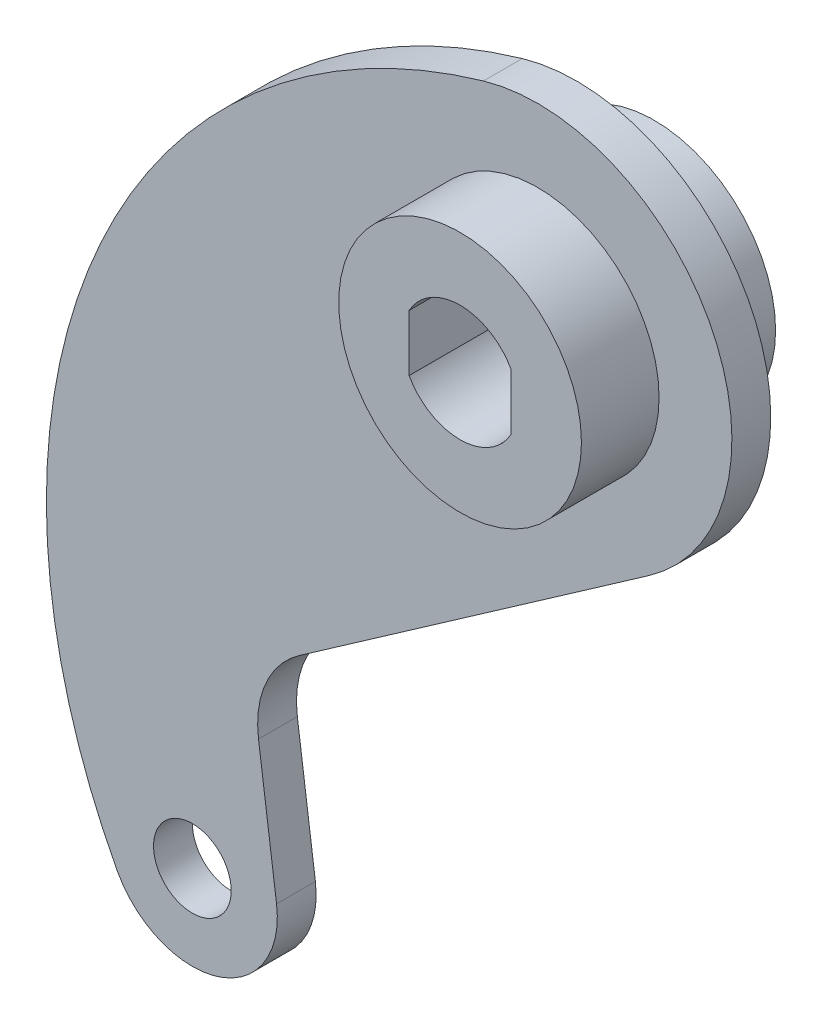
ISO-10303-21;
HEADER;
FILE_DESCRIPTION(('STEP AP214'),'2;1');
FILE_NAME('part.step','',(''),(''),'','','');
FILE_SCHEMA(('AUTOMOTIVE_DESIGN { 1 0 10303 214 1 1 1 1 }'));
ENDSEC;
DATA;
#1=APPLICATION_CONTEXT('core data for automotive mechanical design processes');
#2=APPLICATION_PROTOCOL_DEFINITION('international standard','automotive_design',2000,#1);
#3=PRODUCT_CONTEXT('',#1,'mechanical');
#4=PRODUCT('Part','Part','',(#3));
#5=PRODUCT_RELATED_PRODUCT_CATEGORY('part','',(#4));
#6=PRODUCT_DEFINITION_FORMATION('','',#4);
#7=PRODUCT_DEFINITION_CONTEXT('part definition',#1,'design');
#8=PRODUCT_DEFINITION('design','',#6,#7);
#9=PRODUCT_DEFINITION_SHAPE('','',#8);
#10=(LENGTH_UNIT() NAMED_UNIT(*) SI_UNIT(.MILLI.,.METRE.));
#11=(NAMED_UNIT(*) PLANE_ANGLE_UNIT() SI_UNIT($,.RADIAN.));
#12=(NAMED_UNIT(*) SI_UNIT($,.STERADIAN.) SOLID_ANGLE_UNIT());
#13=UNCERTAINTY_MEASURE_WITH_UNIT(LENGTH_MEASURE(1.E-05),#10,'distance_accuracy_value','');
#14=(GEOMETRIC_REPRESENTATION_CONTEXT(3) GLOBAL_UNCERTAINTY_ASSIGNED_CONTEXT((#13)) GLOBAL_UNIT_ASSIGNED_CONTEXT((#10,
#11,#12)) REPRESENTATION_CONTEXT('',''));
#15=CARTESIAN_POINT('',(0.,0.,0.));
#16=DIRECTION('',(0.,0.,1.));
#17=DIRECTION('',(1.,0.,0.));
#18=AXIS2_PLACEMENT_3D('',#15,#16,#17);
#19=CARTESIAN_POINT('',(0.,0.,16.));
#20=DIRECTION('',(0.,0.,1.));
#21=DIRECTION('',(1.,0.,0.));
#22=AXIS2_PLACEMENT_3D('',#19,#20,#21);
#23=CYLINDRICAL_SURFACE('',#22,40.);
#24=CARTESIAN_POINT('',(0.,0.,24.));
#25=DIRECTION('',(0.,0.,1.));
#26=DIRECTION('',(1.,0.,0.));
#27=AXIS2_PLACEMENT_3D('',#24,#25,#26);
#28=CIRCLE('',#27,40.);
#29=CARTESIAN_POINT('',(22.8949024711143,-32.7997475727812,24.));
#30=VERTEX_POINT('',#29);
#31=CARTESIAN_POINT('',(-11.190557993134,38.4027526591819,24.));
#32=VERTEX_POINT('',#31);
#33=EDGE_CURVE('E145',#30,#32,#28,.T.);
#34=ORIENTED_EDGE('',*,*,#33,.F.);
#35=DIRECTION('',(0.,0.,1.));
#36=VECTOR('',#35,1.);
#37=CARTESIAN_POINT('',(22.8949024711143,-32.7997475727812,16.));
#38=LINE('',#37,#36);
#39=CARTESIAN_POINT('',(22.8949024711143,-32.7997475727812,16.));
#40=VERTEX_POINT('',#39);
#41=EDGE_CURVE('E126',#40,#30,#38,.T.);
#42=ORIENTED_EDGE('',*,*,#41,.F.);
#43=CARTESIAN_POINT('',(0.,0.,16.));
#44=DIRECTION('',(0.,0.,1.));
#45=DIRECTION('',(1.,0.,0.));
#46=AXIS2_PLACEMENT_3D('',#43,#44,#45);
#47=CIRCLE('',#46,40.);
#48=CARTESIAN_POINT('',(-11.190557993134,38.4027526591819,16.));
#49=VERTEX_POINT('',#48);
#50=EDGE_CURVE('E119',#40,#49,#47,.T.);
#51=ORIENTED_EDGE('',*,*,#50,.T.);
#52=DIRECTION('',(0.,0.,1.));
#53=VECTOR('',#52,1.);
#54=CARTESIAN_POINT('',(-11.190557993134,38.4027526591819,16.));
#55=LINE('',#54,#53);
#56=EDGE_CURVE('E102',#49,#32,#55,.T.);
#57=ORIENTED_EDGE('',*,*,#56,.T.);
#58=EDGE_LOOP('',(#34,#42,#51,#57));
#59=FACE_BOUND('',#58,.T.);
#60=ADVANCED_FACE('F51',(#59),#23,.T.);
#61=CARTESIAN_POINT('',(22.8949024711143,-32.7997475727812,16.));
#62=DIRECTION('',(0.572372561777858,-0.819993689319529,0.));
#63=DIRECTION('',(0.819993689319529,0.572372561777858,0.));
#64=AXIS2_PLACEMENT_3D('',#61,#62,#63);
#65=PLANE('',#64);
#66=DIRECTION('',(0.819993689319529,0.572372561777858,0.));
#67=VECTOR('',#66,1.);
#68=CARTESIAN_POINT('',(22.8949024711143,-32.7997475727812,24.));
#69=LINE('',#68,#67);
#70=CARTESIAN_POINT('',(-49.1499316086711,-83.0885324527326,24.));
#71=VERTEX_POINT('',#70);
#72=EDGE_CURVE('E153',#71,#30,#69,.T.);
#73=ORIENTED_EDGE('',*,*,#72,.F.);
#74=DIRECTION('',(0.,0.,1.));
#75=VECTOR('',#74,1.);
#76=CARTESIAN_POINT('',(-49.1499316086711,-83.0885324527326,16.));
#77=LINE('',#76,#75);
#78=CARTESIAN_POINT('',(-49.1499316086711,-83.0885324527326,16.));
#79=VERTEX_POINT('',#78);
#80=EDGE_CURVE('E66',#71,#79,#77,.F.);
#81=ORIENTED_EDGE('',*,*,#80,.T.);
#82=DIRECTION('',(0.819993689319529,0.572372561777858,0.));
#83=VECTOR('',#82,1.);
#84=CARTESIAN_POINT('',(22.8949024711143,-32.7997475727812,16.));
#85=LINE('',#84,#83);
#86=EDGE_CURVE('E113',#79,#40,#85,.T.);
#87=ORIENTED_EDGE('',*,*,#86,.T.);
#88=ORIENTED_EDGE('',*,*,#41,.T.);
#89=EDGE_LOOP('',(#73,#81,#87,#88));
#90=FACE_BOUND('',#89,.T.);
#91=ADVANCED_FACE('F179',(#90),#65,.T.);
#92=CARTESIAN_POINT('',(-70.0330991321324,-9.44993463973792,16.));
#93=DIRECTION('',(0.991018698460731,0.133723368568095,0.));
#94=DIRECTION('',(-0.133723368568095,0.991018698460731,0.));
#95=AXIS2_PLACEMENT_3D('',#92,#93,#94);
#96=PLANE('',#95);
#97=DIRECTION('',(-0.133723368568095,0.991018698460731,0.));
#98=VECTOR('',#97,1.);
#99=CARTESIAN_POINT('',(-70.0330991321324,-9.44993463973792,16.));
#100=LINE('',#99,#98);
#101=CARTESIAN_POINT('',(-53.8054274746344,-129.712579959449,16.));
#102=VERTEX_POINT('',#101);
#103=CARTESIAN_POINT('',(-57.5228543423286,-102.162873610485,16.));
#104=VERTEX_POINT('',#103);
#105=EDGE_CURVE('E135',#102,#104,#100,.T.);
#106=ORIENTED_EDGE('',*,*,#105,.T.);
#107=DIRECTION('',(0.,0.,1.));
#108=VECTOR('',#107,1.);
#109=CARTESIAN_POINT('',(-57.5228543423286,-102.162873610485,24.));
#110=LINE('',#109,#108);
#111=CARTESIAN_POINT('',(-57.5228543423286,-102.162873610485,24.));
#112=VERTEX_POINT('',#111);
#113=EDGE_CURVE('E156',#104,#112,#110,.T.);
#114=ORIENTED_EDGE('',*,*,#113,.T.);
#115=DIRECTION('',(-0.133723368568095,0.991018698460731,0.));
#116=VECTOR('',#115,1.);
#117=CARTESIAN_POINT('',(-70.0330991321324,-9.44993463973792,24.));
#118=LINE('',#117,#116);
#119=CARTESIAN_POINT('',(-53.8054274746344,-129.712579959449,24.));
#120=VERTEX_POINT('',#119);
#121=EDGE_CURVE('E151',#120,#112,#118,.T.);
#122=ORIENTED_EDGE('',*,*,#121,.F.);
#123=DIRECTION('',(0.,0.,1.));
#124=VECTOR('',#123,1.);
#125=CARTESIAN_POINT('',(-53.8054274746344,-129.712579959449,16.));
#126=LINE('',#125,#124);
#127=EDGE_CURVE('E157',#102,#120,#126,.T.);
#128=ORIENTED_EDGE('',*,*,#127,.F.);
#129=EDGE_LOOP('',(#106,#114,#122,#128));
#130=FACE_BOUND('',#129,.T.);
#131=ADVANCED_FACE('F165',(#130),#96,.T.);
#132=CARTESIAN_POINT('',(-71.1482546976971,-132.05273890939,16.));
#133=DIRECTION('',(0.,0.,1.));
#134=DIRECTION('',(1.,0.,0.));
#135=AXIS2_PLACEMENT_3D('',#132,#133,#134);
#136=CYLINDRICAL_SURFACE('',#135,17.4999999999999);
#137=CARTESIAN_POINT('',(-71.1482546976971,-132.05273890939,24.));
#138=DIRECTION('',(0.,0.,1.));
#139=DIRECTION('',(1.,0.,0.));
#140=AXIS2_PLACEMENT_3D('',#137,#138,#139);
#141=CIRCLE('',#140,17.4999999999999);
#142=CARTESIAN_POINT('',(-86.6016810472726,-140.265023248004,24.));
#143=VERTEX_POINT('',#142);
#144=EDGE_CURVE('E148',#143,#120,#141,.T.);
#145=ORIENTED_EDGE('',*,*,#144,.F.);
#146=DIRECTION('',(0.,0.,1.));
#147=VECTOR('',#146,1.);
#148=CARTESIAN_POINT('',(-86.6016810472726,-140.265023248004,16.));
#149=LINE('',#148,#147);
#150=CARTESIAN_POINT('',(-86.6016810472726,-140.265023248004,16.));
#151=VERTEX_POINT('',#150);
#152=EDGE_CURVE('E112',#151,#143,#149,.T.);
#153=ORIENTED_EDGE('',*,*,#152,.F.);
#154=CARTESIAN_POINT('',(-71.1482546976971,-132.05273890939,16.));
#155=DIRECTION('',(0.,0.,1.));
#156=DIRECTION('',(1.,0.,0.));
#157=AXIS2_PLACEMENT_3D('',#154,#155,#156);
#158=CIRCLE('',#157,17.4999999999999);
#159=EDGE_CURVE('E122',#151,#102,#158,.T.);
#160=ORIENTED_EDGE('',*,*,#159,.T.);
#161=ORIENTED_EDGE('',*,*,#127,.T.);
#162=EDGE_LOOP('',(#145,#153,#160,#161));
#163=FACE_BOUND('',#162,.T.);
#164=ADVANCED_FACE('F171',(#163),#136,.T.);
#165=CARTESIAN_POINT('',(-71.1482546976971,-132.05273890939,16.));
#166=DIRECTION('',(0.,0.,1.));
#167=DIRECTION('',(1.,0.,0.));
#168=AXIS2_PLACEMENT_3D('',#165,#166,#167);
#169=CYLINDRICAL_SURFACE('',#168,8.00000000000003);
#170=CARTESIAN_POINT('',(-71.1482546976971,-132.05273890939,16.));
#171=DIRECTION('',(0.,0.,1.));
#172=DIRECTION('',(1.,0.,0.));
#173=AXIS2_PLACEMENT_3D('',#170,#171,#172);
#174=CIRCLE('',#173,8.00000000000003);
#175=CARTESIAN_POINT('',(-63.1482546976971,-132.05273890939,16.));
#176=VERTEX_POINT('',#175);
#177=EDGE_CURVE('E127',#176,#176,#174,.T.);
#178=ORIENTED_EDGE('',*,*,#177,.F.);
#179=EDGE_LOOP('',(#178));
#180=FACE_BOUND('',#179,.T.);
#181=CARTESIAN_POINT('',(-71.1482546976971,-132.05273890939,24.));
#182=DIRECTION('',(0.,0.,1.));
#183=DIRECTION('',(1.,0.,0.));
#184=AXIS2_PLACEMENT_3D('',#181,#182,#183);
#185=CIRCLE('',#184,8.00000000000003);
#186=CARTESIAN_POINT('',(-63.1482546976971,-132.05273890939,24.));
#187=VERTEX_POINT('',#186);
#188=EDGE_CURVE('E142',#187,#187,#185,.T.);
#189=ORIENTED_EDGE('',*,*,#188,.T.);
#190=EDGE_LOOP('',(#189));
#191=FACE_BOUND('',#190,.T.);
#192=ADVANCED_FACE('F188',(#180,#191),#169,.F.);
#193=CARTESIAN_POINT('',(0.,0.,16.));
#194=DIRECTION('',(0.,0.,1.));
#195=DIRECTION('',(1.,0.,0.));
#196=AXIS2_PLACEMENT_3D('',#193,#194,#195);
#197=CYLINDRICAL_SURFACE('',#196,25.);
#198=CARTESIAN_POINT('',(0.,0.,16.));
#199=DIRECTION('',(0.,0.,1.));
#200=DIRECTION('',(1.,0.,0.));
#201=AXIS2_PLACEMENT_3D('',#198,#199,#200);
#202=CIRCLE('',#201,25.);
#203=CARTESIAN_POINT('',(25.,0.,16.));
#204=VERTEX_POINT('',#203);
#205=EDGE_CURVE('E130',#204,#204,#202,.T.);
#206=ORIENTED_EDGE('',*,*,#205,.F.);
#207=EDGE_LOOP('',(#206));
#208=FACE_BOUND('',#207,.T.);
#209=CARTESIAN_POINT('',(0.,0.,24.));
#210=DIRECTION('',(0.,0.,1.));
#211=DIRECTION('',(1.,0.,0.));
#212=AXIS2_PLACEMENT_3D('',#209,#210,#211);
#213=CIRCLE('',#212,25.);
#214=CARTESIAN_POINT('',(25.,0.,24.));
#215=VERTEX_POINT('',#214);
#216=EDGE_CURVE('E139',#215,#215,#213,.T.);
#217=ORIENTED_EDGE('',*,*,#216,.T.);
#218=EDGE_LOOP('',(#217));
#219=FACE_BOUND('',#218,.T.);
#220=ADVANCED_FACE('F190',(#208,#219),#197,.F.);
#221=CARTESIAN_POINT('',(23.7799357354098,-81.6058494007616,16.));
#222=DIRECTION('',(0.,0.,1.));
#223=DIRECTION('',(1.,0.,0.));
#224=AXIS2_PLACEMENT_3D('',#221,#222,#223);
#225=CYLINDRICAL_SURFACE('',#224,125.);
#226=CARTESIAN_POINT('',(23.7799357354098,-81.6058494007616,24.));
#227=DIRECTION('',(0.,0.,1.));
#228=DIRECTION('',(1.,0.,0.));
#229=AXIS2_PLACEMENT_3D('',#226,#227,#228);
#230=CIRCLE('',#229,125.);
#231=EDGE_CURVE('E107',#32,#143,#230,.T.);
#232=ORIENTED_EDGE('',*,*,#231,.F.);
#233=ORIENTED_EDGE('',*,*,#56,.F.);
#234=CARTESIAN_POINT('',(23.7799357354098,-81.6058494007616,16.));
#235=DIRECTION('',(0.,0.,1.));
#236=DIRECTION('',(1.,0.,0.));
#237=AXIS2_PLACEMENT_3D('',#234,#235,#236);
#238=CIRCLE('',#237,125.);
#239=EDGE_CURVE('E105',#49,#151,#238,.T.);
#240=ORIENTED_EDGE('',*,*,#239,.T.);
#241=ORIENTED_EDGE('',*,*,#152,.T.);
#242=EDGE_LOOP('',(#232,#233,#240,#241));
#243=FACE_BOUND('',#242,.T.);
#244=ADVANCED_FACE('F104',(#243),#225,.T.);
#245=CARTESIAN_POINT('',(0.,0.,16.));
#246=DIRECTION('',(0.,0.,1.));
#247=DIRECTION('',(1.,0.,0.));
#248=AXIS2_PLACEMENT_3D('',#245,#246,#247);
#249=PLANE('',#248);
#250=ORIENTED_EDGE('',*,*,#205,.T.);
#251=EDGE_LOOP('',(#250));
#252=FACE_BOUND('',#251,.T.);
#253=ORIENTED_EDGE('',*,*,#177,.T.);
#254=EDGE_LOOP('',(#253));
#255=FACE_BOUND('',#254,.T.);
#256=ORIENTED_EDGE('',*,*,#50,.F.);
#257=ORIENTED_EDGE('',*,*,#86,.F.);
#258=CARTESIAN_POINT('',(-37.702480373114,-99.4884062391232,16.));
#259=DIRECTION('',(0.,0.,1.));
#260=DIRECTION('',(1.,0.,0.));
#261=AXIS2_PLACEMENT_3D('',#258,#259,#260);
#262=CIRCLE('',#261,20.);
#263=EDGE_CURVE('E12',#79,#104,#262,.T.);
#264=ORIENTED_EDGE('',*,*,#263,.T.);
#265=ORIENTED_EDGE('',*,*,#105,.F.);
#266=ORIENTED_EDGE('',*,*,#159,.F.);
#267=ORIENTED_EDGE('',*,*,#239,.F.);
#268=EDGE_LOOP('',(#256,#257,#264,#265,#266,#267));
#269=FACE_BOUND('',#268,.T.);
#270=ADVANCED_FACE('F118',(#252,#255,#269),#249,.F.);
#271=CARTESIAN_POINT('',(0.,0.,24.));
#272=DIRECTION('',(0.,0.,1.));
#273=DIRECTION('',(1.,0.,0.));
#274=AXIS2_PLACEMENT_3D('',#271,#272,#273);
#275=PLANE('',#274);
#276=ORIENTED_EDGE('',*,*,#216,.F.);
#277=EDGE_LOOP('',(#276));
#278=FACE_BOUND('',#277,.T.);
#279=ORIENTED_EDGE('',*,*,#188,.F.);
#280=EDGE_LOOP('',(#279));
#281=FACE_BOUND('',#280,.T.);
#282=ORIENTED_EDGE('',*,*,#33,.T.);
#283=ORIENTED_EDGE('',*,*,#231,.T.);
#284=ORIENTED_EDGE('',*,*,#144,.T.);
#285=ORIENTED_EDGE('',*,*,#121,.T.);
#286=CARTESIAN_POINT('',(-37.702480373114,-99.4884062391232,24.));
#287=DIRECTION('',(0.,0.,1.));
#288=DIRECTION('',(1.,0.,0.));
#289=AXIS2_PLACEMENT_3D('',#286,#287,#288);
#290=CIRCLE('',#289,20.);
#291=EDGE_CURVE('E59',#112,#71,#290,.F.);
#292=ORIENTED_EDGE('',*,*,#291,.T.);
#293=ORIENTED_EDGE('',*,*,#72,.T.);
#294=EDGE_LOOP('',(#282,#283,#284,#285,#292,#293));
#295=FACE_BOUND('',#294,.T.);
#296=ADVANCED_FACE('F168',(#278,#281,#295),#275,.T.);
#297=CARTESIAN_POINT('',(-37.702480373114,-99.4884062391232,16.));
#298=DIRECTION('',(0.,0.,-1.));
#299=DIRECTION('',(-1.,0.,0.));
#300=AXIS2_PLACEMENT_3D('',#297,#298,#299);
#301=CYLINDRICAL_SURFACE('',#300,20.);
#302=ORIENTED_EDGE('',*,*,#263,.F.);
#303=ORIENTED_EDGE('',*,*,#80,.F.);
#304=ORIENTED_EDGE('',*,*,#291,.F.);
#305=ORIENTED_EDGE('',*,*,#113,.F.);
#306=EDGE_LOOP('',(#302,#303,#304,#305));
#307=FACE_BOUND('',#306,.T.);
#308=ADVANCED_FACE('F53',(#307),#301,.F.);
#309=CLOSED_SHELL('',(#60,#91,#131,#164,#192,#220,#244,#270,#296,#308));
#310=MANIFOLD_SOLID_BREP('B2',#309);
#311=CARTESIAN_POINT('',(0.,0.,40.));
#312=DIRECTION('',(0.,0.,-1.));
#313=DIRECTION('',(-1.,0.,0.));
#314=AXIS2_PLACEMENT_3D('',#311,#312,#313);
#315=CYLINDRICAL_SURFACE('',#314,12.);
#316=DIRECTION('',(0.,0.,1.));
#317=VECTOR('',#316,1.);
#318=CARTESIAN_POINT('',(10.5,5.80947501931112,-11.71537451386));
#319=LINE('',#318,#317);
#320=CARTESIAN_POINT('',(10.5,5.80947501931112,0.));
#321=VERTEX_POINT('',#320);
#322=CARTESIAN_POINT('',(10.5,5.80947501931112,40.));
#323=VERTEX_POINT('',#322);
#324=EDGE_CURVE('E290',#321,#323,#319,.T.);
#325=ORIENTED_EDGE('',*,*,#324,.T.);
#326=CARTESIAN_POINT('',(0.,0.,40.));
#327=DIRECTION('',(0.,0.,1.));
#328=DIRECTION('',(1.,0.,0.));
#329=AXIS2_PLACEMENT_3D('',#326,#327,#328);
#330=CIRCLE('',#329,12.);
#331=CARTESIAN_POINT('',(-10.5,5.80947501931112,40.));
#332=VERTEX_POINT('',#331);
#333=EDGE_CURVE('E327',#323,#332,#330,.T.);
#334=ORIENTED_EDGE('',*,*,#333,.T.);
#335=DIRECTION('',(0.,0.,1.));
#336=VECTOR('',#335,1.);
#337=CARTESIAN_POINT('',(-10.5,5.80947501931112,-11.71537451386));
#338=LINE('',#337,#336);
#339=CARTESIAN_POINT('',(-10.5,5.80947501931112,0.));
#340=VERTEX_POINT('',#339);
#341=EDGE_CURVE('E342',#340,#332,#338,.T.);
#342=ORIENTED_EDGE('',*,*,#341,.F.);
#343=CARTESIAN_POINT('',(0.,0.,0.));
#344=DIRECTION('',(0.,0.,1.));
#345=DIRECTION('',(1.,0.,0.));
#346=AXIS2_PLACEMENT_3D('',#343,#344,#345);
#347=CIRCLE('',#346,12.);
#348=EDGE_CURVE('E329',#321,#340,#347,.T.);
#349=ORIENTED_EDGE('',*,*,#348,.F.);
#350=EDGE_LOOP('',(#325,#334,#342,#349));
#351=FACE_BOUND('',#350,.T.);
#352=ADVANCED_FACE('F275',(#351),#315,.F.);
#353=CARTESIAN_POINT('',(0.,0.,40.));
#354=DIRECTION('',(0.,0.,1.));
#355=DIRECTION('',(1.,0.,0.));
#356=AXIS2_PLACEMENT_3D('',#353,#354,#355);
#357=PLANE('',#356);
#358=CARTESIAN_POINT('',(0.,0.,40.));
#359=DIRECTION('',(0.,0.,1.));
#360=DIRECTION('',(1.,0.,0.));
#361=AXIS2_PLACEMENT_3D('',#358,#359,#360);
#362=CIRCLE('',#361,25.);
#363=CARTESIAN_POINT('',(25.,0.,40.));
#364=VERTEX_POINT('',#363);
#365=EDGE_CURVE('E49',#364,#364,#362,.T.);
#366=ORIENTED_EDGE('',*,*,#365,.T.);
#367=EDGE_LOOP('',(#366));
#368=FACE_BOUND('',#367,.T.);
#369=CARTESIAN_POINT('',(-10.5,-5.80947501931112,40.));
#370=VERTEX_POINT('',#369);
#371=CARTESIAN_POINT('',(10.5,-5.80947501931112,40.));
#372=VERTEX_POINT('',#371);
#373=EDGE_CURVE('E334',#370,#372,#330,.T.);
#374=ORIENTED_EDGE('',*,*,#373,.F.);
#375=DIRECTION('',(0.,1.,0.));
#376=VECTOR('',#375,1.);
#377=CARTESIAN_POINT('',(-10.5,-5.80947501931112,40.));
#378=LINE('',#377,#376);
#379=EDGE_CURVE('E333',#370,#332,#378,.T.);
#380=ORIENTED_EDGE('',*,*,#379,.T.);
#381=ORIENTED_EDGE('',*,*,#333,.F.);
#382=DIRECTION('',(0.,-1.,0.));
#383=VECTOR('',#382,1.);
#384=CARTESIAN_POINT('',(10.5,-5.80947501931112,40.));
#385=LINE('',#384,#383);
#386=EDGE_CURVE('E315',#323,#372,#385,.T.);
#387=ORIENTED_EDGE('',*,*,#386,.T.);
#388=EDGE_LOOP('',(#374,#380,#381,#387));
#389=FACE_BOUND('',#388,.T.);
#390=ADVANCED_FACE('F332',(#368,#389),#357,.T.);
#391=CARTESIAN_POINT('',(0.,0.,0.));
#392=DIRECTION('',(0.,0.,1.));
#393=DIRECTION('',(1.,0.,0.));
#394=AXIS2_PLACEMENT_3D('',#391,#392,#393);
#395=PLANE('',#394);
#396=CARTESIAN_POINT('',(0.,0.,0.));
#397=DIRECTION('',(0.,0.,1.));
#398=DIRECTION('',(1.,0.,0.));
#399=AXIS2_PLACEMENT_3D('',#396,#397,#398);
#400=CIRCLE('',#399,25.);
#401=CARTESIAN_POINT('',(25.,0.,0.));
#402=VERTEX_POINT('',#401);
#403=EDGE_CURVE('E279',#402,#402,#400,.T.);
#404=ORIENTED_EDGE('',*,*,#403,.F.);
#405=EDGE_LOOP('',(#404));
#406=FACE_BOUND('',#405,.T.);
#407=CARTESIAN_POINT('',(-10.5,-5.80947501931112,0.));
#408=VERTEX_POINT('',#407);
#409=CARTESIAN_POINT('',(10.5,-5.80947501931112,0.));
#410=VERTEX_POINT('',#409);
#411=EDGE_CURVE('E335',#408,#410,#347,.T.);
#412=ORIENTED_EDGE('',*,*,#411,.T.);
#413=DIRECTION('',(0.,1.,0.));
#414=VECTOR('',#413,1.);
#415=CARTESIAN_POINT('',(10.5,-5.80947501931112,0.));
#416=LINE('',#415,#414);
#417=EDGE_CURVE('E346',#410,#321,#416,.T.);
#418=ORIENTED_EDGE('',*,*,#417,.T.);
#419=ORIENTED_EDGE('',*,*,#348,.T.);
#420=DIRECTION('',(0.,-1.,0.));
#421=VECTOR('',#420,1.);
#422=CARTESIAN_POINT('',(-10.5,-5.80947501931112,0.));
#423=LINE('',#422,#421);
#424=EDGE_CURVE('E340',#340,#408,#423,.T.);
#425=ORIENTED_EDGE('',*,*,#424,.T.);
#426=EDGE_LOOP('',(#412,#418,#419,#425));
#427=FACE_BOUND('',#426,.T.);
#428=ADVANCED_FACE('F349',(#406,#427),#395,.F.);
#429=CARTESIAN_POINT('',(0.,0.,40.));
#430=DIRECTION('',(0.,0.,-1.));
#431=DIRECTION('',(-1.,0.,0.));
#432=AXIS2_PLACEMENT_3D('',#429,#430,#431);
#433=CYLINDRICAL_SURFACE('',#432,25.);
#434=ORIENTED_EDGE('',*,*,#365,.F.);
#435=EDGE_LOOP('',(#434));
#436=FACE_BOUND('',#435,.T.);
#437=ORIENTED_EDGE('',*,*,#403,.T.);
#438=EDGE_LOOP('',(#437));
#439=FACE_BOUND('',#438,.T.);
#440=ADVANCED_FACE('F277',(#436,#439),#433,.T.);
#441=DIRECTION('',(0.,0.,1.));
#442=VECTOR('',#441,1.);
#443=CARTESIAN_POINT('',(10.5,-5.80947501931112,-11.71537451386));
#444=LINE('',#443,#442);
#445=EDGE_CURVE('E318',#410,#372,#444,.T.);
#446=ORIENTED_EDGE('',*,*,#445,.F.);
#447=ORIENTED_EDGE('',*,*,#411,.F.);
#448=DIRECTION('',(0.,0.,1.));
#449=VECTOR('',#448,1.);
#450=CARTESIAN_POINT('',(-10.5,-5.80947501931112,-11.71537451386));
#451=LINE('',#450,#449);
#452=EDGE_CURVE('E298',#408,#370,#451,.T.);
#453=ORIENTED_EDGE('',*,*,#452,.T.);
#454=ORIENTED_EDGE('',*,*,#373,.T.);
#455=EDGE_LOOP('',(#446,#447,#453,#454));
#456=FACE_BOUND('',#455,.T.);
#457=ADVANCED_FACE('F352',(#456),#315,.F.);
#458=CARTESIAN_POINT('',(-10.5,-5.80947501931112,-11.71537451386));
#459=DIRECTION('',(1.,0.,0.));
#460=DIRECTION('',(0.,0.,-1.));
#461=AXIS2_PLACEMENT_3D('',#458,#459,#460);
#462=PLANE('',#461);
#463=ORIENTED_EDGE('',*,*,#424,.F.);
#464=ORIENTED_EDGE('',*,*,#341,.T.);
#465=ORIENTED_EDGE('',*,*,#379,.F.);
#466=ORIENTED_EDGE('',*,*,#452,.F.);
#467=EDGE_LOOP('',(#463,#464,#465,#466));
#468=FACE_BOUND('',#467,.T.);
#469=ADVANCED_FACE('F354',(#468),#462,.T.);
#470=CARTESIAN_POINT('',(10.5,-5.80947501931112,-11.71537451386));
#471=DIRECTION('',(-1.,0.,0.));
#472=DIRECTION('',(0.,0.,1.));
#473=AXIS2_PLACEMENT_3D('',#470,#471,#472);
#474=PLANE('',#473);
#475=ORIENTED_EDGE('',*,*,#417,.F.);
#476=ORIENTED_EDGE('',*,*,#445,.T.);
#477=ORIENTED_EDGE('',*,*,#386,.F.);
#478=ORIENTED_EDGE('',*,*,#324,.F.);
#479=EDGE_LOOP('',(#475,#476,#477,#478));
#480=FACE_BOUND('',#479,.T.);
#481=ADVANCED_FACE('F316',(#480),#474,.T.);
#482=CLOSED_SHELL('',(#352,#390,#428,#440,#457,#469,#481));
#483=MANIFOLD_SOLID_BREP('B6',#482);
#484=ADVANCED_BREP_SHAPE_REPRESENTATION('',(#18,#310,#483),#14);
#485=SHAPE_DEFINITION_REPRESENTATION(#9,#484);
ENDSEC;
END-ISO-10303-21;
